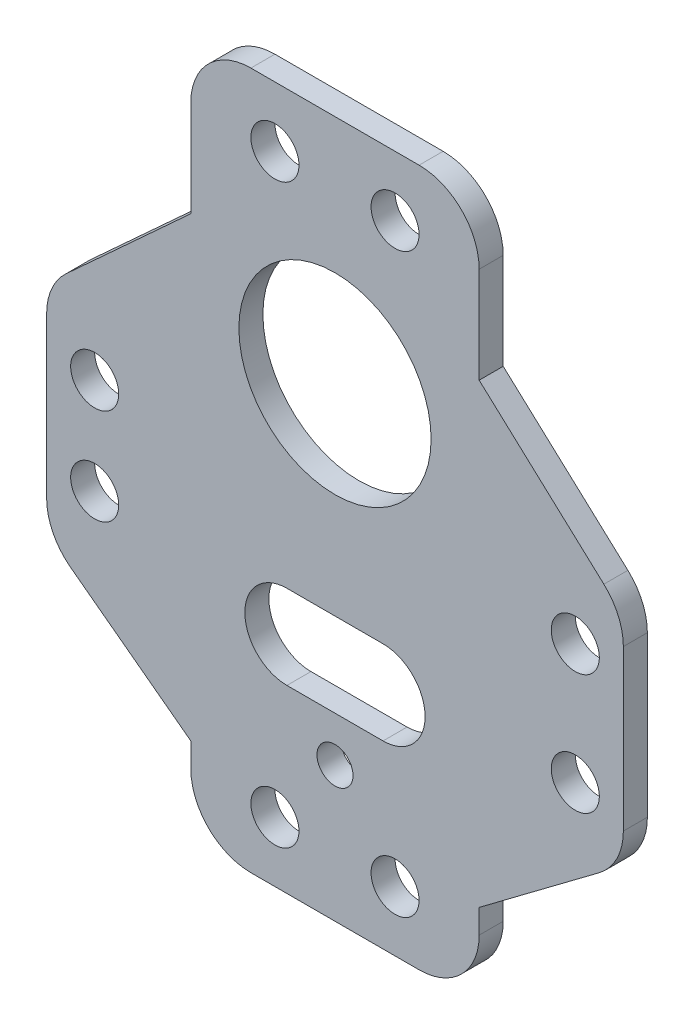
ISO-10303-21;
HEADER;
FILE_DESCRIPTION(('STEP AP214'),'2;1');
FILE_NAME('part.step','',(''),(''),'','','');
FILE_SCHEMA(('AUTOMOTIVE_DESIGN { 1 0 10303 214 1 1 1 1 }'));
ENDSEC;
DATA;
#1=APPLICATION_CONTEXT('core data for automotive mechanical design processes');
#2=APPLICATION_PROTOCOL_DEFINITION('international standard','automotive_design',2000,#1);
#3=PRODUCT_CONTEXT('',#1,'mechanical');
#4=PRODUCT('Part','Part','',(#3));
#5=PRODUCT_RELATED_PRODUCT_CATEGORY('part','',(#4));
#6=PRODUCT_DEFINITION_FORMATION('','',#4);
#7=PRODUCT_DEFINITION_CONTEXT('part definition',#1,'design');
#8=PRODUCT_DEFINITION('design','',#6,#7);
#9=PRODUCT_DEFINITION_SHAPE('','',#8);
#10=(LENGTH_UNIT() NAMED_UNIT(*) SI_UNIT(.MILLI.,.METRE.));
#11=(NAMED_UNIT(*) PLANE_ANGLE_UNIT() SI_UNIT($,.RADIAN.));
#12=(NAMED_UNIT(*) SI_UNIT($,.STERADIAN.) SOLID_ANGLE_UNIT());
#13=UNCERTAINTY_MEASURE_WITH_UNIT(LENGTH_MEASURE(1.E-05),#10,'distance_accuracy_value','');
#14=(GEOMETRIC_REPRESENTATION_CONTEXT(3) GLOBAL_UNCERTAINTY_ASSIGNED_CONTEXT((#13)) GLOBAL_UNIT_ASSIGNED_CONTEXT((#10,
#11,#12)) REPRESENTATION_CONTEXT('',''));
#15=CARTESIAN_POINT('',(0.,0.,0.));
#16=DIRECTION('',(0.,0.,1.));
#17=DIRECTION('',(1.,0.,0.));
#18=AXIS2_PLACEMENT_3D('',#15,#16,#17);
#19=CARTESIAN_POINT('',(0.,0.,2.));
#20=DIRECTION('',(0.,0.,-1.));
#21=DIRECTION('',(-1.,0.,0.));
#22=AXIS2_PLACEMENT_3D('',#19,#20,#21);
#23=PLANE('',#22);
#24=CARTESIAN_POINT('',(28.,-57.,2.));
#25=DIRECTION('',(0.,0.,-1.));
#26=DIRECTION('',(-1.,0.,0.));
#27=AXIS2_PLACEMENT_3D('',#24,#25,#26);
#28=CIRCLE('',#27,2.);
#29=CARTESIAN_POINT('',(26.,-57.,2.));
#30=VERTEX_POINT('',#29);
#31=EDGE_CURVE('E1248',#30,#30,#28,.T.);
#32=ORIENTED_EDGE('',*,*,#31,.T.);
#33=EDGE_LOOP('',(#32));
#34=FACE_BOUND('',#33,.T.);
#35=CARTESIAN_POINT('',(28.,-47.,2.));
#36=DIRECTION('',(0.,0.,-1.));
#37=DIRECTION('',(-1.,0.,0.));
#38=AXIS2_PLACEMENT_3D('',#35,#36,#37);
#39=CIRCLE('',#38,2.);
#40=CARTESIAN_POINT('',(26.,-47.,2.));
#41=VERTEX_POINT('',#40);
#42=EDGE_CURVE('E1241',#41,#41,#39,.T.);
#43=ORIENTED_EDGE('',*,*,#42,.T.);
#44=EDGE_LOOP('',(#43));
#45=FACE_BOUND('',#44,.T.);
#46=CARTESIAN_POINT('',(8.00000000000001,-38.25,2.));
#47=DIRECTION('',(0.,0.,1.));
#48=DIRECTION('',(1.,0.,0.));
#49=AXIS2_PLACEMENT_3D('',#46,#47,#48);
#50=CIRCLE('',#49,8.);
#51=CARTESIAN_POINT('',(16.,-38.25,2.));
#52=VERTEX_POINT('',#51);
#53=EDGE_CURVE('E679',#52,#52,#50,.T.);
#54=ORIENTED_EDGE('',*,*,#53,.F.);
#55=EDGE_LOOP('',(#54));
#56=FACE_BOUND('',#55,.T.);
#57=DIRECTION('',(-0.800000000000001,-0.599999999999999,0.));
#58=VECTOR('',#57,1.);
#59=CARTESIAN_POINT('',(32.,-61.,2.));
#60=LINE('',#59,#58);
#61=CARTESIAN_POINT('',(30.,-62.5,2.));
#62=VERTEX_POINT('',#61);
#63=CARTESIAN_POINT('',(20.,-70.,2.));
#64=VERTEX_POINT('',#63);
#65=EDGE_CURVE('E688',#62,#64,#60,.T.);
#66=ORIENTED_EDGE('',*,*,#65,.F.);
#67=CARTESIAN_POINT('',(27.,-58.5,2.));
#68=DIRECTION('',(0.,0.,-1.));
#69=DIRECTION('',(-1.,0.,0.));
#70=AXIS2_PLACEMENT_3D('',#67,#68,#69);
#71=CIRCLE('',#70,5.);
#72=CARTESIAN_POINT('',(32.,-58.5,2.));
#73=VERTEX_POINT('',#72);
#74=EDGE_CURVE('E792',#62,#73,#71,.F.);
#75=ORIENTED_EDGE('',*,*,#74,.T.);
#76=DIRECTION('',(0.,-1.,0.));
#77=VECTOR('',#76,1.);
#78=CARTESIAN_POINT('',(32.,-43.,2.));
#79=LINE('',#78,#77);
#80=CARTESIAN_POINT('',(32.,-45.1995085817082,2.));
#81=VERTEX_POINT('',#80);
#82=EDGE_CURVE('E685',#81,#73,#79,.T.);
#83=ORIENTED_EDGE('',*,*,#82,.F.);
#84=CARTESIAN_POINT('',(27.,-45.1995085817082,2.));
#85=DIRECTION('',(0.,0.,-1.));
#86=DIRECTION('',(-1.,0.,0.));
#87=AXIS2_PLACEMENT_3D('',#84,#85,#86);
#88=CIRCLE('',#87,5.);
#89=CARTESIAN_POINT('',(30.3786231425867,-41.5137378807045,2.));
#90=VERTEX_POINT('',#89);
#91=EDGE_CURVE('E790',#81,#90,#88,.F.);
#92=ORIENTED_EDGE('',*,*,#91,.T.);
#93=DIRECTION('',(-0.737154140200742,0.675724628517346,0.));
#94=VECTOR('',#93,1.);
#95=CARTESIAN_POINT('',(32.,-43.,2.));
#96=LINE('',#95,#94);
#97=CARTESIAN_POINT('',(20.,-32.,2.));
#98=VERTEX_POINT('',#97);
#99=EDGE_CURVE('E713',#90,#98,#96,.T.);
#100=ORIENTED_EDGE('',*,*,#99,.T.);
#101=DIRECTION('',(0.,1.,0.));
#102=VECTOR('',#101,1.);
#103=CARTESIAN_POINT('',(20.,-32.,2.));
#104=LINE('',#103,#102);
#105=CARTESIAN_POINT('',(20.,-24.,2.));
#106=VERTEX_POINT('',#105);
#107=EDGE_CURVE('E710',#98,#106,#104,.T.);
#108=ORIENTED_EDGE('',*,*,#107,.T.);
#109=CARTESIAN_POINT('',(15.,-24.,2.));
#110=DIRECTION('',(0.,0.,-1.));
#111=DIRECTION('',(-1.,0.,0.));
#112=AXIS2_PLACEMENT_3D('',#109,#110,#111);
#113=CIRCLE('',#112,5.);
#114=CARTESIAN_POINT('',(15.,-19.,2.));
#115=VERTEX_POINT('',#114);
#116=EDGE_CURVE('E782',#106,#115,#113,.F.);
#117=ORIENTED_EDGE('',*,*,#116,.T.);
#118=DIRECTION('',(-1.,0.,0.));
#119=VECTOR('',#118,1.);
#120=CARTESIAN_POINT('',(20.,-19.,2.));
#121=LINE('',#120,#119);
#122=CARTESIAN_POINT('',(0.999999999999997,-19.,2.));
#123=VERTEX_POINT('',#122);
#124=EDGE_CURVE('E707',#115,#123,#121,.T.);
#125=ORIENTED_EDGE('',*,*,#124,.T.);
#126=CARTESIAN_POINT('',(0.999999999999999,-24.,2.));
#127=DIRECTION('',(0.,0.,-1.));
#128=DIRECTION('',(-1.,0.,0.));
#129=AXIS2_PLACEMENT_3D('',#126,#127,#128);
#130=CIRCLE('',#129,5.);
#131=CARTESIAN_POINT('',(-4.,-24.,2.));
#132=VERTEX_POINT('',#131);
#133=EDGE_CURVE('E784',#123,#132,#130,.F.);
#134=ORIENTED_EDGE('',*,*,#133,.T.);
#135=DIRECTION('',(0.,1.,0.));
#136=VECTOR('',#135,1.);
#137=CARTESIAN_POINT('',(-4.00000000000001,-32.,2.));
#138=LINE('',#137,#136);
#139=CARTESIAN_POINT('',(-4.00000000000001,-32.,2.));
#140=VERTEX_POINT('',#139);
#141=EDGE_CURVE('E704',#140,#132,#138,.T.);
#142=ORIENTED_EDGE('',*,*,#141,.F.);
#143=DIRECTION('',(0.737154140200741,0.675724628517347,0.));
#144=VECTOR('',#143,1.);
#145=CARTESIAN_POINT('',(-16.,-43.,2.));
#146=LINE('',#145,#144);
#147=CARTESIAN_POINT('',(-14.3786231425867,-41.5137378807045,2.));
#148=VERTEX_POINT('',#147);
#149=EDGE_CURVE('E702',#148,#140,#146,.T.);
#150=ORIENTED_EDGE('',*,*,#149,.F.);
#151=CARTESIAN_POINT('',(-11.,-45.1995085817082,2.));
#152=DIRECTION('',(0.,0.,-1.));
#153=DIRECTION('',(-1.,0.,0.));
#154=AXIS2_PLACEMENT_3D('',#151,#152,#153);
#155=CIRCLE('',#154,5.);
#156=CARTESIAN_POINT('',(-16.,-45.1995085817082,2.));
#157=VERTEX_POINT('',#156);
#158=EDGE_CURVE('E786',#148,#157,#155,.F.);
#159=ORIENTED_EDGE('',*,*,#158,.T.);
#160=DIRECTION('',(0.,-1.,0.));
#161=VECTOR('',#160,1.);
#162=CARTESIAN_POINT('',(-16.,-43.,2.));
#163=LINE('',#162,#161);
#164=CARTESIAN_POINT('',(-16.,-58.5,2.));
#165=VERTEX_POINT('',#164);
#166=EDGE_CURVE('E699',#157,#165,#163,.T.);
#167=ORIENTED_EDGE('',*,*,#166,.T.);
#168=CARTESIAN_POINT('',(-11.,-58.5,2.));
#169=DIRECTION('',(0.,0.,-1.));
#170=DIRECTION('',(-1.,0.,0.));
#171=AXIS2_PLACEMENT_3D('',#168,#169,#170);
#172=CIRCLE('',#171,5.);
#173=CARTESIAN_POINT('',(-14.,-62.5,2.));
#174=VERTEX_POINT('',#173);
#175=EDGE_CURVE('E788',#165,#174,#172,.F.);
#176=ORIENTED_EDGE('',*,*,#175,.T.);
#177=DIRECTION('',(0.8,-0.6,0.));
#178=VECTOR('',#177,1.);
#179=CARTESIAN_POINT('',(-16.,-61.,2.));
#180=LINE('',#179,#178);
#181=CARTESIAN_POINT('',(-4.,-70.,2.));
#182=VERTEX_POINT('',#181);
#183=EDGE_CURVE('E697',#174,#182,#180,.T.);
#184=ORIENTED_EDGE('',*,*,#183,.T.);
#185=DIRECTION('',(0.,-1.,0.));
#186=VECTOR('',#185,1.);
#187=CARTESIAN_POINT('',(-4.,-70.,2.));
#188=LINE('',#187,#186);
#189=CARTESIAN_POINT('',(-4.,-72.,2.));
#190=VERTEX_POINT('',#189);
#191=EDGE_CURVE('E695',#182,#190,#188,.T.);
#192=ORIENTED_EDGE('',*,*,#191,.T.);
#193=CARTESIAN_POINT('',(1.,-72.,2.));
#194=DIRECTION('',(0.,0.,-1.));
#195=DIRECTION('',(-1.,0.,0.));
#196=AXIS2_PLACEMENT_3D('',#193,#194,#195);
#197=CIRCLE('',#196,5.);
#198=CARTESIAN_POINT('',(1.,-77.,2.));
#199=VERTEX_POINT('',#198);
#200=EDGE_CURVE('E494',#190,#199,#197,.F.);
#201=ORIENTED_EDGE('',*,*,#200,.T.);
#202=DIRECTION('',(-1.,0.,0.));
#203=VECTOR('',#202,1.);
#204=CARTESIAN_POINT('',(20.,-77.,2.));
#205=LINE('',#204,#203);
#206=CARTESIAN_POINT('',(15.,-77.,2.));
#207=VERTEX_POINT('',#206);
#208=EDGE_CURVE('E693',#207,#199,#205,.T.);
#209=ORIENTED_EDGE('',*,*,#208,.F.);
#210=CARTESIAN_POINT('',(15.,-72.,2.));
#211=DIRECTION('',(0.,0.,-1.));
#212=DIRECTION('',(-1.,0.,0.));
#213=AXIS2_PLACEMENT_3D('',#210,#211,#212);
#214=CIRCLE('',#213,5.);
#215=CARTESIAN_POINT('',(20.,-72.,2.));
#216=VERTEX_POINT('',#215);
#217=EDGE_CURVE('E488',#207,#216,#214,.F.);
#218=ORIENTED_EDGE('',*,*,#217,.T.);
#219=DIRECTION('',(0.,-1.,0.));
#220=VECTOR('',#219,1.);
#221=CARTESIAN_POINT('',(20.,-70.,2.));
#222=LINE('',#221,#220);
#223=EDGE_CURVE('E691',#64,#216,#222,.T.);
#224=ORIENTED_EDGE('',*,*,#223,.F.);
#225=EDGE_LOOP('',(#66,#75,#83,#92,#100,#108,#117,#125,#134,#142,#150,#159,#167,#176,#184,#192,
#201,#209,#218,#224));
#226=FACE_BOUND('',#225,.T.);
#227=DIRECTION('',(1.,0.,0.));
#228=VECTOR('',#227,1.);
#229=CARTESIAN_POINT('',(4.,-62.,2.));
#230=LINE('',#229,#228);
#231=CARTESIAN_POINT('',(4.,-62.,2.));
#232=VERTEX_POINT('',#231);
#233=CARTESIAN_POINT('',(12.,-62.,2.));
#234=VERTEX_POINT('',#233);
#235=EDGE_CURVE('E636',#232,#234,#230,.T.);
#236=ORIENTED_EDGE('',*,*,#235,.F.);
#237=CARTESIAN_POINT('',(4.,-58.5,2.));
#238=DIRECTION('',(0.,0.,1.));
#239=DIRECTION('',(1.,0.,0.));
#240=AXIS2_PLACEMENT_3D('',#237,#238,#239);
#241=CIRCLE('',#240,3.5);
#242=CARTESIAN_POINT('',(4.,-55.,2.));
#243=VERTEX_POINT('',#242);
#244=EDGE_CURVE('E661',#243,#232,#241,.T.);
#245=ORIENTED_EDGE('',*,*,#244,.F.);
#246=DIRECTION('',(1.,0.,0.));
#247=VECTOR('',#246,1.);
#248=CARTESIAN_POINT('',(4.,-55.,2.));
#249=LINE('',#248,#247);
#250=CARTESIAN_POINT('',(12.,-55.,2.));
#251=VERTEX_POINT('',#250);
#252=EDGE_CURVE('E659',#243,#251,#249,.T.);
#253=ORIENTED_EDGE('',*,*,#252,.T.);
#254=CARTESIAN_POINT('',(12.,-58.5,2.));
#255=DIRECTION('',(0.,0.,1.));
#256=DIRECTION('',(1.,0.,0.));
#257=AXIS2_PLACEMENT_3D('',#254,#255,#256);
#258=CIRCLE('',#257,3.5);
#259=EDGE_CURVE('E646',#234,#251,#258,.T.);
#260=ORIENTED_EDGE('',*,*,#259,.F.);
#261=EDGE_LOOP('',(#236,#245,#253,#260));
#262=FACE_BOUND('',#261,.T.);
#263=CARTESIAN_POINT('',(13.,-72.,2.));
#264=DIRECTION('',(0.,0.,1.));
#265=DIRECTION('',(1.,0.,0.));
#266=AXIS2_PLACEMENT_3D('',#263,#264,#265);
#267=CIRCLE('',#266,2.);
#268=CARTESIAN_POINT('',(15.,-72.,2.));
#269=VERTEX_POINT('',#268);
#270=EDGE_CURVE('E668',#269,#269,#267,.T.);
#271=ORIENTED_EDGE('',*,*,#270,.F.);
#272=EDGE_LOOP('',(#271));
#273=FACE_BOUND('',#272,.T.);
#274=CARTESIAN_POINT('',(3.,-72.,2.));
#275=DIRECTION('',(0.,0.,1.));
#276=DIRECTION('',(1.,0.,0.));
#277=AXIS2_PLACEMENT_3D('',#274,#275,#276);
#278=CIRCLE('',#277,2.);
#279=CARTESIAN_POINT('',(5.,-72.,2.));
#280=VERTEX_POINT('',#279);
#281=EDGE_CURVE('E1253',#280,#280,#278,.T.);
#282=ORIENTED_EDGE('',*,*,#281,.F.);
#283=EDGE_LOOP('',(#282));
#284=FACE_BOUND('',#283,.T.);
#285=CARTESIAN_POINT('',(-12.,-56.,2.));
#286=DIRECTION('',(0.,0.,1.));
#287=DIRECTION('',(1.,0.,0.));
#288=AXIS2_PLACEMENT_3D('',#285,#286,#287);
#289=CIRCLE('',#288,2.);
#290=CARTESIAN_POINT('',(-9.99999999999999,-56.,2.));
#291=VERTEX_POINT('',#290);
#292=EDGE_CURVE('E1258',#291,#291,#289,.T.);
#293=ORIENTED_EDGE('',*,*,#292,.F.);
#294=EDGE_LOOP('',(#293));
#295=FACE_BOUND('',#294,.T.);
#296=CARTESIAN_POINT('',(-12.,-48.,2.));
#297=DIRECTION('',(0.,0.,1.));
#298=DIRECTION('',(1.,0.,0.));
#299=AXIS2_PLACEMENT_3D('',#296,#297,#298);
#300=CIRCLE('',#299,2.);
#301=CARTESIAN_POINT('',(-9.99999999999999,-48.,2.));
#302=VERTEX_POINT('',#301);
#303=EDGE_CURVE('E1264',#302,#302,#300,.T.);
#304=ORIENTED_EDGE('',*,*,#303,.F.);
#305=EDGE_LOOP('',(#304));
#306=FACE_BOUND('',#305,.T.);
#307=CARTESIAN_POINT('',(13.,-24.,2.));
#308=DIRECTION('',(0.,0.,1.));
#309=DIRECTION('',(1.,0.,0.));
#310=AXIS2_PLACEMENT_3D('',#307,#308,#309);
#311=CIRCLE('',#310,2.);
#312=CARTESIAN_POINT('',(15.,-24.,2.));
#313=VERTEX_POINT('',#312);
#314=EDGE_CURVE('E1270',#313,#313,#311,.T.);
#315=ORIENTED_EDGE('',*,*,#314,.F.);
#316=EDGE_LOOP('',(#315));
#317=FACE_BOUND('',#316,.T.);
#318=CARTESIAN_POINT('',(3.,-24.,2.));
#319=DIRECTION('',(0.,0.,1.));
#320=DIRECTION('',(1.,0.,0.));
#321=AXIS2_PLACEMENT_3D('',#318,#319,#320);
#322=CIRCLE('',#321,2.);
#323=CARTESIAN_POINT('',(5.,-24.,2.));
#324=VERTEX_POINT('',#323);
#325=EDGE_CURVE('E1276',#324,#324,#322,.T.);
#326=ORIENTED_EDGE('',*,*,#325,.F.);
#327=EDGE_LOOP('',(#326));
#328=FACE_BOUND('',#327,.T.);
#329=CARTESIAN_POINT('',(8.00000000000001,-65.75,2.));
#330=DIRECTION('',(0.,0.,1.));
#331=DIRECTION('',(1.,0.,0.));
#332=AXIS2_PLACEMENT_3D('',#329,#330,#331);
#333=CIRCLE('',#332,1.5);
#334=CARTESIAN_POINT('',(9.50000000000002,-65.75,2.));
#335=VERTEX_POINT('',#334);
#336=EDGE_CURVE('E1282',#335,#335,#333,.T.);
#337=ORIENTED_EDGE('',*,*,#336,.F.);
#338=EDGE_LOOP('',(#337));
#339=FACE_BOUND('',#338,.T.);
#340=ADVANCED_FACE('F473',(#34,#45,#56,#226,#262,#273,#284,#295,#306,#317,#328,#339),#23,.F.);
#341=CARTESIAN_POINT('',(0.,0.,0.));
#342=DIRECTION('',(0.,0.,-1.));
#343=DIRECTION('',(-1.,0.,0.));
#344=AXIS2_PLACEMENT_3D('',#341,#342,#343);
#345=PLANE('',#344);
#346=CARTESIAN_POINT('',(3.,-24.,0.));
#347=DIRECTION('',(0.,0.,1.));
#348=DIRECTION('',(1.,0.,0.));
#349=AXIS2_PLACEMENT_3D('',#346,#347,#348);
#350=CIRCLE('',#349,2.);
#351=CARTESIAN_POINT('',(5.,-24.,0.));
#352=VERTEX_POINT('',#351);
#353=EDGE_CURVE('E1279',#352,#352,#350,.T.);
#354=ORIENTED_EDGE('',*,*,#353,.T.);
#355=EDGE_LOOP('',(#354));
#356=FACE_BOUND('',#355,.T.);
#357=CARTESIAN_POINT('',(-12.,-48.,0.));
#358=DIRECTION('',(0.,0.,1.));
#359=DIRECTION('',(1.,0.,0.));
#360=AXIS2_PLACEMENT_3D('',#357,#358,#359);
#361=CIRCLE('',#360,2.);
#362=CARTESIAN_POINT('',(-9.99999999999999,-48.,0.));
#363=VERTEX_POINT('',#362);
#364=EDGE_CURVE('E1267',#363,#363,#361,.T.);
#365=ORIENTED_EDGE('',*,*,#364,.T.);
#366=EDGE_LOOP('',(#365));
#367=FACE_BOUND('',#366,.T.);
#368=CARTESIAN_POINT('',(3.,-72.,0.));
#369=DIRECTION('',(0.,0.,1.));
#370=DIRECTION('',(1.,0.,0.));
#371=AXIS2_PLACEMENT_3D('',#368,#369,#370);
#372=CIRCLE('',#371,2.);
#373=CARTESIAN_POINT('',(5.,-72.,0.));
#374=VERTEX_POINT('',#373);
#375=EDGE_CURVE('E1255',#374,#374,#372,.T.);
#376=ORIENTED_EDGE('',*,*,#375,.T.);
#377=EDGE_LOOP('',(#376));
#378=FACE_BOUND('',#377,.T.);
#379=CARTESIAN_POINT('',(28.,-57.,0.));
#380=DIRECTION('',(0.,0.,-1.));
#381=DIRECTION('',(-1.,0.,0.));
#382=AXIS2_PLACEMENT_3D('',#379,#380,#381);
#383=CIRCLE('',#382,2.);
#384=CARTESIAN_POINT('',(26.,-57.,0.));
#385=VERTEX_POINT('',#384);
#386=EDGE_CURVE('E1250',#385,#385,#383,.T.);
#387=ORIENTED_EDGE('',*,*,#386,.F.);
#388=EDGE_LOOP('',(#387));
#389=FACE_BOUND('',#388,.T.);
#390=CARTESIAN_POINT('',(28.,-47.,0.));
#391=DIRECTION('',(0.,0.,-1.));
#392=DIRECTION('',(-1.,0.,0.));
#393=AXIS2_PLACEMENT_3D('',#390,#391,#392);
#394=CIRCLE('',#393,2.);
#395=CARTESIAN_POINT('',(26.,-47.,0.));
#396=VERTEX_POINT('',#395);
#397=EDGE_CURVE('E1244',#396,#396,#394,.T.);
#398=ORIENTED_EDGE('',*,*,#397,.F.);
#399=EDGE_LOOP('',(#398));
#400=FACE_BOUND('',#399,.T.);
#401=CARTESIAN_POINT('',(4.,-58.5,0.));
#402=DIRECTION('',(0.,0.,1.));
#403=DIRECTION('',(1.,0.,0.));
#404=AXIS2_PLACEMENT_3D('',#401,#402,#403);
#405=CIRCLE('',#404,3.5);
#406=CARTESIAN_POINT('',(4.,-55.,0.));
#407=VERTEX_POINT('',#406);
#408=CARTESIAN_POINT('',(4.,-62.,0.));
#409=VERTEX_POINT('',#408);
#410=EDGE_CURVE('E647',#407,#409,#405,.T.);
#411=ORIENTED_EDGE('',*,*,#410,.T.);
#412=DIRECTION('',(1.,0.,0.));
#413=VECTOR('',#412,1.);
#414=CARTESIAN_POINT('',(4.,-62.,0.));
#415=LINE('',#414,#413);
#416=CARTESIAN_POINT('',(12.,-62.,0.));
#417=VERTEX_POINT('',#416);
#418=EDGE_CURVE('E666',#409,#417,#415,.T.);
#419=ORIENTED_EDGE('',*,*,#418,.T.);
#420=CARTESIAN_POINT('',(12.,-58.5,0.));
#421=DIRECTION('',(0.,0.,1.));
#422=DIRECTION('',(1.,0.,0.));
#423=AXIS2_PLACEMENT_3D('',#420,#421,#422);
#424=CIRCLE('',#423,3.5);
#425=CARTESIAN_POINT('',(12.,-55.,0.));
#426=VERTEX_POINT('',#425);
#427=EDGE_CURVE('E653',#417,#426,#424,.T.);
#428=ORIENTED_EDGE('',*,*,#427,.T.);
#429=DIRECTION('',(1.,0.,0.));
#430=VECTOR('',#429,1.);
#431=CARTESIAN_POINT('',(4.,-55.,0.));
#432=LINE('',#431,#430);
#433=EDGE_CURVE('E670',#407,#426,#432,.T.);
#434=ORIENTED_EDGE('',*,*,#433,.F.);
#435=EDGE_LOOP('',(#411,#419,#428,#434));
#436=FACE_BOUND('',#435,.T.);
#437=CARTESIAN_POINT('',(8.00000000000001,-38.25,0.));
#438=DIRECTION('',(0.,0.,1.));
#439=DIRECTION('',(1.,0.,0.));
#440=AXIS2_PLACEMENT_3D('',#437,#438,#439);
#441=CIRCLE('',#440,8.);
#442=CARTESIAN_POINT('',(16.,-38.25,0.));
#443=VERTEX_POINT('',#442);
#444=EDGE_CURVE('E654',#443,#443,#441,.T.);
#445=ORIENTED_EDGE('',*,*,#444,.T.);
#446=EDGE_LOOP('',(#445));
#447=FACE_BOUND('',#446,.T.);
#448=DIRECTION('',(0.,-1.,0.));
#449=VECTOR('',#448,1.);
#450=CARTESIAN_POINT('',(32.,-43.,0.));
#451=LINE('',#450,#449);
#452=CARTESIAN_POINT('',(32.,-45.1995085817082,0.));
#453=VERTEX_POINT('',#452);
#454=CARTESIAN_POINT('',(32.,-58.5,0.));
#455=VERTEX_POINT('',#454);
#456=EDGE_CURVE('E682',#453,#455,#451,.T.);
#457=ORIENTED_EDGE('',*,*,#456,.T.);
#458=CARTESIAN_POINT('',(27.,-58.5,0.));
#459=DIRECTION('',(0.,0.,-1.));
#460=DIRECTION('',(-1.,0.,0.));
#461=AXIS2_PLACEMENT_3D('',#458,#459,#460);
#462=CIRCLE('',#461,5.);
#463=CARTESIAN_POINT('',(30.,-62.5,0.));
#464=VERTEX_POINT('',#463);
#465=EDGE_CURVE('E776',#455,#464,#462,.T.);
#466=ORIENTED_EDGE('',*,*,#465,.T.);
#467=DIRECTION('',(-0.800000000000001,-0.599999999999999,0.));
#468=VECTOR('',#467,1.);
#469=CARTESIAN_POINT('',(32.,-61.,0.));
#470=LINE('',#469,#468);
#471=CARTESIAN_POINT('',(20.,-70.,0.));
#472=VERTEX_POINT('',#471);
#473=EDGE_CURVE('E718',#464,#472,#470,.T.);
#474=ORIENTED_EDGE('',*,*,#473,.T.);
#475=DIRECTION('',(0.,-1.,0.));
#476=VECTOR('',#475,1.);
#477=CARTESIAN_POINT('',(20.,-70.,0.));
#478=LINE('',#477,#476);
#479=CARTESIAN_POINT('',(20.,-72.,0.));
#480=VERTEX_POINT('',#479);
#481=EDGE_CURVE('E720',#472,#480,#478,.T.);
#482=ORIENTED_EDGE('',*,*,#481,.T.);
#483=CARTESIAN_POINT('',(15.,-72.,0.));
#484=DIRECTION('',(0.,0.,-1.));
#485=DIRECTION('',(-1.,0.,0.));
#486=AXIS2_PLACEMENT_3D('',#483,#484,#485);
#487=CIRCLE('',#486,5.);
#488=CARTESIAN_POINT('',(15.,-77.,0.));
#489=VERTEX_POINT('',#488);
#490=EDGE_CURVE('E764',#480,#489,#487,.T.);
#491=ORIENTED_EDGE('',*,*,#490,.T.);
#492=DIRECTION('',(-1.,0.,0.));
#493=VECTOR('',#492,1.);
#494=CARTESIAN_POINT('',(20.,-77.,0.));
#495=LINE('',#494,#493);
#496=CARTESIAN_POINT('',(1.,-77.,0.));
#497=VERTEX_POINT('',#496);
#498=EDGE_CURVE('E723',#489,#497,#495,.T.);
#499=ORIENTED_EDGE('',*,*,#498,.T.);
#500=CARTESIAN_POINT('',(1.,-72.,0.));
#501=DIRECTION('',(0.,0.,-1.));
#502=DIRECTION('',(-1.,0.,0.));
#503=AXIS2_PLACEMENT_3D('',#500,#501,#502);
#504=CIRCLE('',#503,5.);
#505=CARTESIAN_POINT('',(-4.,-72.,0.));
#506=VERTEX_POINT('',#505);
#507=EDGE_CURVE('E762',#497,#506,#504,.T.);
#508=ORIENTED_EDGE('',*,*,#507,.T.);
#509=DIRECTION('',(0.,-1.,0.));
#510=VECTOR('',#509,1.);
#511=CARTESIAN_POINT('',(-4.,-70.,0.));
#512=LINE('',#511,#510);
#513=CARTESIAN_POINT('',(-4.,-70.,0.));
#514=VERTEX_POINT('',#513);
#515=EDGE_CURVE('E726',#514,#506,#512,.T.);
#516=ORIENTED_EDGE('',*,*,#515,.F.);
#517=DIRECTION('',(0.8,-0.6,0.));
#518=VECTOR('',#517,1.);
#519=CARTESIAN_POINT('',(-16.,-61.,0.));
#520=LINE('',#519,#518);
#521=CARTESIAN_POINT('',(-14.,-62.5,0.));
#522=VERTEX_POINT('',#521);
#523=EDGE_CURVE('E729',#522,#514,#520,.T.);
#524=ORIENTED_EDGE('',*,*,#523,.F.);
#525=CARTESIAN_POINT('',(-11.,-58.5,0.));
#526=DIRECTION('',(0.,0.,-1.));
#527=DIRECTION('',(-1.,0.,0.));
#528=AXIS2_PLACEMENT_3D('',#525,#526,#527);
#529=CIRCLE('',#528,5.);
#530=CARTESIAN_POINT('',(-16.,-58.5,0.));
#531=VERTEX_POINT('',#530);
#532=EDGE_CURVE('E772',#522,#531,#529,.T.);
#533=ORIENTED_EDGE('',*,*,#532,.T.);
#534=DIRECTION('',(0.,-1.,0.));
#535=VECTOR('',#534,1.);
#536=CARTESIAN_POINT('',(-16.,-43.,0.));
#537=LINE('',#536,#535);
#538=CARTESIAN_POINT('',(-16.,-45.1995085817082,0.));
#539=VERTEX_POINT('',#538);
#540=EDGE_CURVE('E731',#539,#531,#537,.T.);
#541=ORIENTED_EDGE('',*,*,#540,.F.);
#542=CARTESIAN_POINT('',(-11.,-45.1995085817082,0.));
#543=DIRECTION('',(0.,0.,-1.));
#544=DIRECTION('',(-1.,0.,0.));
#545=AXIS2_PLACEMENT_3D('',#542,#543,#544);
#546=CIRCLE('',#545,5.);
#547=CARTESIAN_POINT('',(-14.3786231425867,-41.5137378807045,0.));
#548=VERTEX_POINT('',#547);
#549=EDGE_CURVE('E770',#539,#548,#546,.T.);
#550=ORIENTED_EDGE('',*,*,#549,.T.);
#551=DIRECTION('',(0.737154140200741,0.675724628517347,0.));
#552=VECTOR('',#551,1.);
#553=CARTESIAN_POINT('',(-16.,-43.,0.));
#554=LINE('',#553,#552);
#555=CARTESIAN_POINT('',(-4.00000000000001,-32.,0.));
#556=VERTEX_POINT('',#555);
#557=EDGE_CURVE('E734',#548,#556,#554,.T.);
#558=ORIENTED_EDGE('',*,*,#557,.T.);
#559=DIRECTION('',(0.,1.,0.));
#560=VECTOR('',#559,1.);
#561=CARTESIAN_POINT('',(-4.00000000000001,-32.,0.));
#562=LINE('',#561,#560);
#563=CARTESIAN_POINT('',(-4.,-24.,0.));
#564=VERTEX_POINT('',#563);
#565=EDGE_CURVE('E736',#556,#564,#562,.T.);
#566=ORIENTED_EDGE('',*,*,#565,.T.);
#567=CARTESIAN_POINT('',(0.999999999999999,-24.,0.));
#568=DIRECTION('',(0.,0.,-1.));
#569=DIRECTION('',(-1.,0.,0.));
#570=AXIS2_PLACEMENT_3D('',#567,#568,#569);
#571=CIRCLE('',#570,5.);
#572=CARTESIAN_POINT('',(0.999999999999997,-19.,0.));
#573=VERTEX_POINT('',#572);
#574=EDGE_CURVE('E768',#564,#573,#571,.T.);
#575=ORIENTED_EDGE('',*,*,#574,.T.);
#576=DIRECTION('',(-1.,0.,0.));
#577=VECTOR('',#576,1.);
#578=CARTESIAN_POINT('',(20.,-19.,0.));
#579=LINE('',#578,#577);
#580=CARTESIAN_POINT('',(15.,-19.,0.));
#581=VERTEX_POINT('',#580);
#582=EDGE_CURVE('E739',#581,#573,#579,.T.);
#583=ORIENTED_EDGE('',*,*,#582,.F.);
#584=CARTESIAN_POINT('',(15.,-24.,0.));
#585=DIRECTION('',(0.,0.,-1.));
#586=DIRECTION('',(-1.,0.,0.));
#587=AXIS2_PLACEMENT_3D('',#584,#585,#586);
#588=CIRCLE('',#587,5.);
#589=CARTESIAN_POINT('',(20.,-24.,0.));
#590=VERTEX_POINT('',#589);
#591=EDGE_CURVE('E766',#581,#590,#588,.T.);
#592=ORIENTED_EDGE('',*,*,#591,.T.);
#593=DIRECTION('',(0.,1.,0.));
#594=VECTOR('',#593,1.);
#595=CARTESIAN_POINT('',(20.,-32.,0.));
#596=LINE('',#595,#594);
#597=CARTESIAN_POINT('',(20.,-32.,0.));
#598=VERTEX_POINT('',#597);
#599=EDGE_CURVE('E742',#598,#590,#596,.T.);
#600=ORIENTED_EDGE('',*,*,#599,.F.);
#601=DIRECTION('',(-0.737154140200742,0.675724628517346,0.));
#602=VECTOR('',#601,1.);
#603=CARTESIAN_POINT('',(32.,-43.,0.));
#604=LINE('',#603,#602);
#605=CARTESIAN_POINT('',(30.3786231425867,-41.5137378807045,0.));
#606=VERTEX_POINT('',#605);
#607=EDGE_CURVE('E689',#606,#598,#604,.T.);
#608=ORIENTED_EDGE('',*,*,#607,.F.);
#609=CARTESIAN_POINT('',(27.,-45.1995085817082,0.));
#610=DIRECTION('',(0.,0.,-1.));
#611=DIRECTION('',(-1.,0.,0.));
#612=AXIS2_PLACEMENT_3D('',#609,#610,#611);
#613=CIRCLE('',#612,5.);
#614=EDGE_CURVE('E774',#606,#453,#613,.T.);
#615=ORIENTED_EDGE('',*,*,#614,.T.);
#616=EDGE_LOOP('',(#457,#466,#474,#482,#491,#499,#508,#516,#524,#533,#541,#550,#558,#566,#575,
#583,#592,#600,#608,#615));
#617=FACE_BOUND('',#616,.T.);
#618=CARTESIAN_POINT('',(13.,-72.,0.));
#619=DIRECTION('',(0.,0.,1.));
#620=DIRECTION('',(1.,0.,0.));
#621=AXIS2_PLACEMENT_3D('',#618,#619,#620);
#622=CIRCLE('',#621,2.);
#623=CARTESIAN_POINT('',(15.,-72.,0.));
#624=VERTEX_POINT('',#623);
#625=EDGE_CURVE('E1240',#624,#624,#622,.T.);
#626=ORIENTED_EDGE('',*,*,#625,.T.);
#627=EDGE_LOOP('',(#626));
#628=FACE_BOUND('',#627,.T.);
#629=CARTESIAN_POINT('',(-12.,-56.,0.));
#630=DIRECTION('',(0.,0.,1.));
#631=DIRECTION('',(1.,0.,0.));
#632=AXIS2_PLACEMENT_3D('',#629,#630,#631);
#633=CIRCLE('',#632,2.);
#634=CARTESIAN_POINT('',(-9.99999999999999,-56.,0.));
#635=VERTEX_POINT('',#634);
#636=EDGE_CURVE('E1261',#635,#635,#633,.T.);
#637=ORIENTED_EDGE('',*,*,#636,.T.);
#638=EDGE_LOOP('',(#637));
#639=FACE_BOUND('',#638,.T.);
#640=CARTESIAN_POINT('',(13.,-24.,0.));
#641=DIRECTION('',(0.,0.,1.));
#642=DIRECTION('',(1.,0.,0.));
#643=AXIS2_PLACEMENT_3D('',#640,#641,#642);
#644=CIRCLE('',#643,2.);
#645=CARTESIAN_POINT('',(15.,-24.,0.));
#646=VERTEX_POINT('',#645);
#647=EDGE_CURVE('E1273',#646,#646,#644,.T.);
#648=ORIENTED_EDGE('',*,*,#647,.T.);
#649=EDGE_LOOP('',(#648));
#650=FACE_BOUND('',#649,.T.);
#651=CARTESIAN_POINT('',(8.00000000000001,-65.75,0.));
#652=DIRECTION('',(0.,0.,1.));
#653=DIRECTION('',(1.,0.,0.));
#654=AXIS2_PLACEMENT_3D('',#651,#652,#653);
#655=CIRCLE('',#654,1.5);
#656=CARTESIAN_POINT('',(9.50000000000002,-65.75,0.));
#657=VERTEX_POINT('',#656);
#658=EDGE_CURVE('E1285',#657,#657,#655,.T.);
#659=ORIENTED_EDGE('',*,*,#658,.T.);
#660=EDGE_LOOP('',(#659));
#661=FACE_BOUND('',#660,.T.);
#662=ADVANCED_FACE('F836',(#356,#367,#378,#389,#400,#436,#447,#617,#628,#639,#650,#661),#345,.T.);
#663=CARTESIAN_POINT('',(32.,-43.,2.));
#664=DIRECTION('',(1.,0.,0.));
#665=DIRECTION('',(0.,0.,-1.));
#666=AXIS2_PLACEMENT_3D('',#663,#664,#665);
#667=PLANE('',#666);
#668=ORIENTED_EDGE('',*,*,#82,.T.);
#669=DIRECTION('',(0.,0.,-1.));
#670=VECTOR('',#669,1.);
#671=CARTESIAN_POINT('',(32.,-58.5,2.));
#672=LINE('',#671,#670);
#673=EDGE_CURVE('E759',#73,#455,#672,.T.);
#674=ORIENTED_EDGE('',*,*,#673,.T.);
#675=ORIENTED_EDGE('',*,*,#456,.F.);
#676=DIRECTION('',(0.,0.,-1.));
#677=VECTOR('',#676,1.);
#678=CARTESIAN_POINT('',(32.,-45.1995085817082,2.));
#679=LINE('',#678,#677);
#680=EDGE_CURVE('E749',#453,#81,#679,.F.);
#681=ORIENTED_EDGE('',*,*,#680,.T.);
#682=EDGE_LOOP('',(#668,#674,#675,#681));
#683=FACE_BOUND('',#682,.T.);
#684=ADVANCED_FACE('F849',(#683),#667,.T.);
#685=CARTESIAN_POINT('',(32.,-43.,2.));
#686=DIRECTION('',(-0.675724628517346,-0.737154140200742,0.));
#687=DIRECTION('',(0.737154140200742,-0.675724628517346,0.));
#688=AXIS2_PLACEMENT_3D('',#685,#686,#687);
#689=PLANE('',#688);
#690=ORIENTED_EDGE('',*,*,#99,.F.);
#691=DIRECTION('',(0.,0.,-1.));
#692=VECTOR('',#691,1.);
#693=CARTESIAN_POINT('',(30.3786231425867,-41.5137378807045,0.));
#694=LINE('',#693,#692);
#695=EDGE_CURVE('E794',#90,#606,#694,.T.);
#696=ORIENTED_EDGE('',*,*,#695,.T.);
#697=ORIENTED_EDGE('',*,*,#607,.T.);
#698=DIRECTION('',(0.,0.,-1.));
#699=VECTOR('',#698,1.);
#700=CARTESIAN_POINT('',(20.,-32.,2.));
#701=LINE('',#700,#699);
#702=EDGE_CURVE('E746',#98,#598,#701,.T.);
#703=ORIENTED_EDGE('',*,*,#702,.F.);
#704=EDGE_LOOP('',(#690,#696,#697,#703));
#705=FACE_BOUND('',#704,.T.);
#706=ADVANCED_FACE('F859',(#705),#689,.F.);
#707=CARTESIAN_POINT('',(20.,-32.,2.));
#708=DIRECTION('',(-1.,0.,0.));
#709=DIRECTION('',(0.,-1.,0.));
#710=AXIS2_PLACEMENT_3D('',#707,#708,#709);
#711=PLANE('',#710);
#712=ORIENTED_EDGE('',*,*,#599,.T.);
#713=DIRECTION('',(0.,0.,-1.));
#714=VECTOR('',#713,1.);
#715=CARTESIAN_POINT('',(20.,-24.,2.));
#716=LINE('',#715,#714);
#717=EDGE_CURVE('E815',#590,#106,#716,.F.);
#718=ORIENTED_EDGE('',*,*,#717,.T.);
#719=ORIENTED_EDGE('',*,*,#107,.F.);
#720=ORIENTED_EDGE('',*,*,#702,.T.);
#721=EDGE_LOOP('',(#712,#718,#719,#720));
#722=FACE_BOUND('',#721,.T.);
#723=ADVANCED_FACE('F934',(#722),#711,.F.);
#724=CARTESIAN_POINT('',(20.,-19.,2.));
#725=DIRECTION('',(0.,-1.,0.));
#726=DIRECTION('',(0.,0.,-1.));
#727=AXIS2_PLACEMENT_3D('',#724,#725,#726);
#728=PLANE('',#727);
#729=ORIENTED_EDGE('',*,*,#582,.T.);
#730=DIRECTION('',(0.,0.,-1.));
#731=VECTOR('',#730,1.);
#732=CARTESIAN_POINT('',(0.999999999999999,-19.,2.));
#733=LINE('',#732,#731);
#734=EDGE_CURVE('E813',#573,#123,#733,.F.);
#735=ORIENTED_EDGE('',*,*,#734,.T.);
#736=ORIENTED_EDGE('',*,*,#124,.F.);
#737=DIRECTION('',(0.,0.,-1.));
#738=VECTOR('',#737,1.);
#739=CARTESIAN_POINT('',(15.,-19.,2.));
#740=LINE('',#739,#738);
#741=EDGE_CURVE('E810',#115,#581,#740,.T.);
#742=ORIENTED_EDGE('',*,*,#741,.T.);
#743=EDGE_LOOP('',(#729,#735,#736,#742));
#744=FACE_BOUND('',#743,.T.);
#745=ADVANCED_FACE('F871',(#744),#728,.F.);
#746=CARTESIAN_POINT('',(-4.00000000000001,-32.,2.));
#747=DIRECTION('',(-1.,0.,0.));
#748=DIRECTION('',(0.,-1.,0.));
#749=AXIS2_PLACEMENT_3D('',#746,#747,#748);
#750=PLANE('',#749);
#751=ORIENTED_EDGE('',*,*,#141,.T.);
#752=DIRECTION('',(0.,0.,-1.));
#753=VECTOR('',#752,1.);
#754=CARTESIAN_POINT('',(-4.,-24.,0.));
#755=LINE('',#754,#753);
#756=EDGE_CURVE('E807',#132,#564,#755,.T.);
#757=ORIENTED_EDGE('',*,*,#756,.T.);
#758=ORIENTED_EDGE('',*,*,#565,.F.);
#759=DIRECTION('',(0.,0.,-1.));
#760=VECTOR('',#759,1.);
#761=CARTESIAN_POINT('',(-4.00000000000001,-32.,2.));
#762=LINE('',#761,#760);
#763=EDGE_CURVE('E750',#140,#556,#762,.T.);
#764=ORIENTED_EDGE('',*,*,#763,.F.);
#765=EDGE_LOOP('',(#751,#757,#758,#764));
#766=FACE_BOUND('',#765,.T.);
#767=ADVANCED_FACE('F879',(#766),#750,.T.);
#768=CARTESIAN_POINT('',(-16.,-43.,2.));
#769=DIRECTION('',(-0.675724628517347,0.737154140200741,0.));
#770=DIRECTION('',(-0.737154140200741,-0.675724628517347,0.));
#771=AXIS2_PLACEMENT_3D('',#768,#769,#770);
#772=PLANE('',#771);
#773=ORIENTED_EDGE('',*,*,#557,.F.);
#774=DIRECTION('',(0.,0.,-1.));
#775=VECTOR('',#774,1.);
#776=CARTESIAN_POINT('',(-14.3786231425867,-41.5137378807045,2.));
#777=LINE('',#776,#775);
#778=EDGE_CURVE('E805',#548,#148,#777,.F.);
#779=ORIENTED_EDGE('',*,*,#778,.T.);
#780=ORIENTED_EDGE('',*,*,#149,.T.);
#781=ORIENTED_EDGE('',*,*,#763,.T.);
#782=EDGE_LOOP('',(#773,#779,#780,#781));
#783=FACE_BOUND('',#782,.T.);
#784=ADVANCED_FACE('F941',(#783),#772,.T.);
#785=CARTESIAN_POINT('',(-16.,-43.,2.));
#786=DIRECTION('',(1.,0.,0.));
#787=DIRECTION('',(0.,1.,0.));
#788=AXIS2_PLACEMENT_3D('',#785,#786,#787);
#789=PLANE('',#788);
#790=ORIENTED_EDGE('',*,*,#540,.T.);
#791=DIRECTION('',(0.,0.,-1.));
#792=VECTOR('',#791,1.);
#793=CARTESIAN_POINT('',(-16.,-58.5,2.));
#794=LINE('',#793,#792);
#795=EDGE_CURVE('E803',#531,#165,#794,.F.);
#796=ORIENTED_EDGE('',*,*,#795,.T.);
#797=ORIENTED_EDGE('',*,*,#166,.F.);
#798=DIRECTION('',(0.,0.,-1.));
#799=VECTOR('',#798,1.);
#800=CARTESIAN_POINT('',(-16.,-45.1995085817082,0.));
#801=LINE('',#800,#799);
#802=EDGE_CURVE('E800',#157,#539,#801,.T.);
#803=ORIENTED_EDGE('',*,*,#802,.T.);
#804=EDGE_LOOP('',(#790,#796,#797,#803));
#805=FACE_BOUND('',#804,.T.);
#806=ADVANCED_FACE('F892',(#805),#789,.F.);
#807=CARTESIAN_POINT('',(-16.,-61.,2.));
#808=DIRECTION('',(0.6,0.8,0.));
#809=DIRECTION('',(-0.8,0.6,0.));
#810=AXIS2_PLACEMENT_3D('',#807,#808,#809);
#811=PLANE('',#810);
#812=ORIENTED_EDGE('',*,*,#183,.F.);
#813=DIRECTION('',(0.,0.,-1.));
#814=VECTOR('',#813,1.);
#815=CARTESIAN_POINT('',(-14.,-62.5,2.));
#816=LINE('',#815,#814);
#817=EDGE_CURVE('E797',#174,#522,#816,.T.);
#818=ORIENTED_EDGE('',*,*,#817,.T.);
#819=ORIENTED_EDGE('',*,*,#523,.T.);
#820=DIRECTION('',(0.,0.,-1.));
#821=VECTOR('',#820,1.);
#822=CARTESIAN_POINT('',(-4.,-70.,2.));
#823=LINE('',#822,#821);
#824=EDGE_CURVE('E753',#182,#514,#823,.T.);
#825=ORIENTED_EDGE('',*,*,#824,.F.);
#826=EDGE_LOOP('',(#812,#818,#819,#825));
#827=FACE_BOUND('',#826,.T.);
#828=ADVANCED_FACE('F903',(#827),#811,.F.);
#829=CARTESIAN_POINT('',(-4.,-70.,2.));
#830=DIRECTION('',(1.,0.,0.));
#831=DIRECTION('',(0.,1.,0.));
#832=AXIS2_PLACEMENT_3D('',#829,#830,#831);
#833=PLANE('',#832);
#834=ORIENTED_EDGE('',*,*,#515,.T.);
#835=DIRECTION('',(0.,0.,-1.));
#836=VECTOR('',#835,1.);
#837=CARTESIAN_POINT('',(-4.,-72.,2.));
#838=LINE('',#837,#836);
#839=EDGE_CURVE('E12',#506,#190,#838,.F.);
#840=ORIENTED_EDGE('',*,*,#839,.T.);
#841=ORIENTED_EDGE('',*,*,#191,.F.);
#842=ORIENTED_EDGE('',*,*,#824,.T.);
#843=EDGE_LOOP('',(#834,#840,#841,#842));
#844=FACE_BOUND('',#843,.T.);
#845=ADVANCED_FACE('F909',(#844),#833,.F.);
#846=CARTESIAN_POINT('',(20.,-77.,2.));
#847=DIRECTION('',(0.,-1.,0.));
#848=DIRECTION('',(0.,0.,-1.));
#849=AXIS2_PLACEMENT_3D('',#846,#847,#848);
#850=PLANE('',#849);
#851=ORIENTED_EDGE('',*,*,#498,.F.);
#852=DIRECTION('',(0.,0.,-1.));
#853=VECTOR('',#852,1.);
#854=CARTESIAN_POINT('',(15.,-77.,2.));
#855=LINE('',#854,#853);
#856=EDGE_CURVE('E481',#489,#207,#855,.F.);
#857=ORIENTED_EDGE('',*,*,#856,.T.);
#858=ORIENTED_EDGE('',*,*,#208,.T.);
#859=DIRECTION('',(0.,0.,-1.));
#860=VECTOR('',#859,1.);
#861=CARTESIAN_POINT('',(1.,-77.,0.));
#862=LINE('',#861,#860);
#863=EDGE_CURVE('E820',#199,#497,#862,.T.);
#864=ORIENTED_EDGE('',*,*,#863,.T.);
#865=EDGE_LOOP('',(#851,#857,#858,#864));
#866=FACE_BOUND('',#865,.T.);
#867=ADVANCED_FACE('F825',(#866),#850,.T.);
#868=CARTESIAN_POINT('',(20.,-70.,2.));
#869=DIRECTION('',(1.,0.,0.));
#870=DIRECTION('',(0.,0.,-1.));
#871=AXIS2_PLACEMENT_3D('',#868,#869,#870);
#872=PLANE('',#871);
#873=ORIENTED_EDGE('',*,*,#223,.T.);
#874=DIRECTION('',(0.,0.,-1.));
#875=VECTOR('',#874,1.);
#876=CARTESIAN_POINT('',(20.,-72.,2.));
#877=LINE('',#876,#875);
#878=EDGE_CURVE('E817',#216,#480,#877,.T.);
#879=ORIENTED_EDGE('',*,*,#878,.T.);
#880=ORIENTED_EDGE('',*,*,#481,.F.);
#881=DIRECTION('',(0.,0.,-1.));
#882=VECTOR('',#881,1.);
#883=CARTESIAN_POINT('',(20.,-70.,2.));
#884=LINE('',#883,#882);
#885=EDGE_CURVE('E715',#64,#472,#884,.T.);
#886=ORIENTED_EDGE('',*,*,#885,.F.);
#887=EDGE_LOOP('',(#873,#879,#880,#886));
#888=FACE_BOUND('',#887,.T.);
#889=ADVANCED_FACE('F833',(#888),#872,.T.);
#890=CARTESIAN_POINT('',(32.,-61.,2.));
#891=DIRECTION('',(0.599999999999999,-0.800000000000001,0.));
#892=DIRECTION('',(0.800000000000001,0.599999999999999,0.));
#893=AXIS2_PLACEMENT_3D('',#890,#891,#892);
#894=PLANE('',#893);
#895=ORIENTED_EDGE('',*,*,#473,.F.);
#896=DIRECTION('',(0.,0.,-1.));
#897=VECTOR('',#896,1.);
#898=CARTESIAN_POINT('',(30.,-62.5,2.));
#899=LINE('',#898,#897);
#900=EDGE_CURVE('E778',#464,#62,#899,.F.);
#901=ORIENTED_EDGE('',*,*,#900,.T.);
#902=ORIENTED_EDGE('',*,*,#65,.T.);
#903=ORIENTED_EDGE('',*,*,#885,.T.);
#904=EDGE_LOOP('',(#895,#901,#902,#903));
#905=FACE_BOUND('',#904,.T.);
#906=ADVANCED_FACE('F841',(#905),#894,.T.);
#907=CARTESIAN_POINT('',(8.00000000000001,-38.25,2.));
#908=DIRECTION('',(0.,0.,-1.));
#909=DIRECTION('',(-1.,0.,0.));
#910=AXIS2_PLACEMENT_3D('',#907,#908,#909);
#911=CYLINDRICAL_SURFACE('',#910,8.);
#912=ORIENTED_EDGE('',*,*,#53,.T.);
#913=EDGE_LOOP('',(#912));
#914=FACE_BOUND('',#913,.T.);
#915=ORIENTED_EDGE('',*,*,#444,.F.);
#916=EDGE_LOOP('',(#915));
#917=FACE_BOUND('',#916,.T.);
#918=ADVANCED_FACE('F929',(#914,#917),#911,.F.);
#919=CARTESIAN_POINT('',(4.,-62.,2.));
#920=DIRECTION('',(0.,1.,0.));
#921=DIRECTION('',(0.,0.,1.));
#922=AXIS2_PLACEMENT_3D('',#919,#920,#921);
#923=PLANE('',#922);
#924=ORIENTED_EDGE('',*,*,#418,.F.);
#925=DIRECTION('',(0.,0.,-1.));
#926=VECTOR('',#925,1.);
#927=CARTESIAN_POINT('',(4.,-62.,2.));
#928=LINE('',#927,#926);
#929=EDGE_CURVE('E642',#232,#409,#928,.T.);
#930=ORIENTED_EDGE('',*,*,#929,.F.);
#931=ORIENTED_EDGE('',*,*,#235,.T.);
#932=DIRECTION('',(0.,0.,-1.));
#933=VECTOR('',#932,1.);
#934=CARTESIAN_POINT('',(12.,-62.,2.));
#935=LINE('',#934,#933);
#936=EDGE_CURVE('E639',#234,#417,#935,.T.);
#937=ORIENTED_EDGE('',*,*,#936,.T.);
#938=EDGE_LOOP('',(#924,#930,#931,#937));
#939=FACE_BOUND('',#938,.T.);
#940=ADVANCED_FACE('F638',(#939),#923,.T.);
#941=CARTESIAN_POINT('',(12.,-58.5,2.));
#942=DIRECTION('',(0.,0.,-1.));
#943=DIRECTION('',(-1.,0.,0.));
#944=AXIS2_PLACEMENT_3D('',#941,#942,#943);
#945=CYLINDRICAL_SURFACE('',#944,3.5);
#946=ORIENTED_EDGE('',*,*,#427,.F.);
#947=ORIENTED_EDGE('',*,*,#936,.F.);
#948=ORIENTED_EDGE('',*,*,#259,.T.);
#949=DIRECTION('',(0.,0.,-1.));
#950=VECTOR('',#949,1.);
#951=CARTESIAN_POINT('',(12.,-55.,2.));
#952=LINE('',#951,#950);
#953=EDGE_CURVE('E655',#251,#426,#952,.T.);
#954=ORIENTED_EDGE('',*,*,#953,.T.);
#955=EDGE_LOOP('',(#946,#947,#948,#954));
#956=FACE_BOUND('',#955,.T.);
#957=ADVANCED_FACE('F650',(#956),#945,.F.);
#958=CARTESIAN_POINT('',(4.,-55.,2.));
#959=DIRECTION('',(0.,1.,0.));
#960=DIRECTION('',(0.,0.,1.));
#961=AXIS2_PLACEMENT_3D('',#958,#959,#960);
#962=PLANE('',#961);
#963=ORIENTED_EDGE('',*,*,#433,.T.);
#964=ORIENTED_EDGE('',*,*,#953,.F.);
#965=ORIENTED_EDGE('',*,*,#252,.F.);
#966=DIRECTION('',(0.,0.,-1.));
#967=VECTOR('',#966,1.);
#968=CARTESIAN_POINT('',(4.,-55.,2.));
#969=LINE('',#968,#967);
#970=EDGE_CURVE('E676',#243,#407,#969,.T.);
#971=ORIENTED_EDGE('',*,*,#970,.T.);
#972=EDGE_LOOP('',(#963,#964,#965,#971));
#973=FACE_BOUND('',#972,.T.);
#974=ADVANCED_FACE('F1191',(#973),#962,.F.);
#975=CARTESIAN_POINT('',(4.,-58.5,2.));
#976=DIRECTION('',(0.,0.,-1.));
#977=DIRECTION('',(-1.,0.,0.));
#978=AXIS2_PLACEMENT_3D('',#975,#976,#977);
#979=CYLINDRICAL_SURFACE('',#978,3.5);
#980=ORIENTED_EDGE('',*,*,#410,.F.);
#981=ORIENTED_EDGE('',*,*,#970,.F.);
#982=ORIENTED_EDGE('',*,*,#244,.T.);
#983=ORIENTED_EDGE('',*,*,#929,.T.);
#984=EDGE_LOOP('',(#980,#981,#982,#983));
#985=FACE_BOUND('',#984,.T.);
#986=ADVANCED_FACE('F1181',(#985),#979,.F.);
#987=CARTESIAN_POINT('',(13.,-72.,2.));
#988=DIRECTION('',(0.,0.,-1.));
#989=DIRECTION('',(-1.,0.,0.));
#990=AXIS2_PLACEMENT_3D('',#987,#988,#989);
#991=CYLINDRICAL_SURFACE('',#990,2.);
#992=ORIENTED_EDGE('',*,*,#270,.T.);
#993=EDGE_LOOP('',(#992));
#994=FACE_BOUND('',#993,.T.);
#995=ORIENTED_EDGE('',*,*,#625,.F.);
#996=EDGE_LOOP('',(#995));
#997=FACE_BOUND('',#996,.T.);
#998=ADVANCED_FACE('F1171',(#994,#997),#991,.F.);
#999=CARTESIAN_POINT('',(28.,-47.,2.));
#1000=DIRECTION('',(0.,0.,-1.));
#1001=DIRECTION('',(-1.,0.,0.));
#1002=AXIS2_PLACEMENT_3D('',#999,#1000,#1001);
#1003=CYLINDRICAL_SURFACE('',#1002,2.);
#1004=ORIENTED_EDGE('',*,*,#42,.F.);
#1005=EDGE_LOOP('',(#1004));
#1006=FACE_BOUND('',#1005,.T.);
#1007=ORIENTED_EDGE('',*,*,#397,.T.);
#1008=EDGE_LOOP('',(#1007));
#1009=FACE_BOUND('',#1008,.T.);
#1010=ADVANCED_FACE('F1161',(#1006,#1009),#1003,.F.);
#1011=CARTESIAN_POINT('',(28.,-57.,2.));
#1012=DIRECTION('',(0.,0.,-1.));
#1013=DIRECTION('',(-1.,0.,0.));
#1014=AXIS2_PLACEMENT_3D('',#1011,#1012,#1013);
#1015=CYLINDRICAL_SURFACE('',#1014,2.);
#1016=ORIENTED_EDGE('',*,*,#31,.F.);
#1017=EDGE_LOOP('',(#1016));
#1018=FACE_BOUND('',#1017,.T.);
#1019=ORIENTED_EDGE('',*,*,#386,.T.);
#1020=EDGE_LOOP('',(#1019));
#1021=FACE_BOUND('',#1020,.T.);
#1022=ADVANCED_FACE('F1151',(#1018,#1021),#1015,.F.);
#1023=CARTESIAN_POINT('',(3.,-72.,2.));
#1024=DIRECTION('',(0.,0.,-1.));
#1025=DIRECTION('',(-1.,0.,0.));
#1026=AXIS2_PLACEMENT_3D('',#1023,#1024,#1025);
#1027=CYLINDRICAL_SURFACE('',#1026,2.);
#1028=ORIENTED_EDGE('',*,*,#281,.T.);
#1029=EDGE_LOOP('',(#1028));
#1030=FACE_BOUND('',#1029,.T.);
#1031=ORIENTED_EDGE('',*,*,#375,.F.);
#1032=EDGE_LOOP('',(#1031));
#1033=FACE_BOUND('',#1032,.T.);
#1034=ADVANCED_FACE('F1141',(#1030,#1033),#1027,.F.);
#1035=CARTESIAN_POINT('',(-12.,-56.,2.));
#1036=DIRECTION('',(0.,0.,-1.));
#1037=DIRECTION('',(-1.,0.,0.));
#1038=AXIS2_PLACEMENT_3D('',#1035,#1036,#1037);
#1039=CYLINDRICAL_SURFACE('',#1038,2.);
#1040=ORIENTED_EDGE('',*,*,#292,.T.);
#1041=EDGE_LOOP('',(#1040));
#1042=FACE_BOUND('',#1041,.T.);
#1043=ORIENTED_EDGE('',*,*,#636,.F.);
#1044=EDGE_LOOP('',(#1043));
#1045=FACE_BOUND('',#1044,.T.);
#1046=ADVANCED_FACE('F1131',(#1042,#1045),#1039,.F.);
#1047=CARTESIAN_POINT('',(-12.,-48.,2.));
#1048=DIRECTION('',(0.,0.,-1.));
#1049=DIRECTION('',(-1.,0.,0.));
#1050=AXIS2_PLACEMENT_3D('',#1047,#1048,#1049);
#1051=CYLINDRICAL_SURFACE('',#1050,2.);
#1052=ORIENTED_EDGE('',*,*,#303,.T.);
#1053=EDGE_LOOP('',(#1052));
#1054=FACE_BOUND('',#1053,.T.);
#1055=ORIENTED_EDGE('',*,*,#364,.F.);
#1056=EDGE_LOOP('',(#1055));
#1057=FACE_BOUND('',#1056,.T.);
#1058=ADVANCED_FACE('F1121',(#1054,#1057),#1051,.F.);
#1059=CARTESIAN_POINT('',(13.,-24.,2.));
#1060=DIRECTION('',(0.,0.,-1.));
#1061=DIRECTION('',(-1.,0.,0.));
#1062=AXIS2_PLACEMENT_3D('',#1059,#1060,#1061);
#1063=CYLINDRICAL_SURFACE('',#1062,2.);
#1064=ORIENTED_EDGE('',*,*,#314,.T.);
#1065=EDGE_LOOP('',(#1064));
#1066=FACE_BOUND('',#1065,.T.);
#1067=ORIENTED_EDGE('',*,*,#647,.F.);
#1068=EDGE_LOOP('',(#1067));
#1069=FACE_BOUND('',#1068,.T.);
#1070=ADVANCED_FACE('F1111',(#1066,#1069),#1063,.F.);
#1071=CARTESIAN_POINT('',(3.,-24.,2.));
#1072=DIRECTION('',(0.,0.,-1.));
#1073=DIRECTION('',(-1.,0.,0.));
#1074=AXIS2_PLACEMENT_3D('',#1071,#1072,#1073);
#1075=CYLINDRICAL_SURFACE('',#1074,2.);
#1076=ORIENTED_EDGE('',*,*,#325,.T.);
#1077=EDGE_LOOP('',(#1076));
#1078=FACE_BOUND('',#1077,.T.);
#1079=ORIENTED_EDGE('',*,*,#353,.F.);
#1080=EDGE_LOOP('',(#1079));
#1081=FACE_BOUND('',#1080,.T.);
#1082=ADVANCED_FACE('F1101',(#1078,#1081),#1075,.F.);
#1083=CARTESIAN_POINT('',(8.00000000000001,-65.75,2.));
#1084=DIRECTION('',(0.,0.,-1.));
#1085=DIRECTION('',(-1.,0.,0.));
#1086=AXIS2_PLACEMENT_3D('',#1083,#1084,#1085);
#1087=CYLINDRICAL_SURFACE('',#1086,1.5);
#1088=ORIENTED_EDGE('',*,*,#336,.T.);
#1089=EDGE_LOOP('',(#1088));
#1090=FACE_BOUND('',#1089,.T.);
#1091=ORIENTED_EDGE('',*,*,#658,.F.);
#1092=EDGE_LOOP('',(#1091));
#1093=FACE_BOUND('',#1092,.T.);
#1094=ADVANCED_FACE('F990',(#1090,#1093),#1087,.F.);
#1095=CARTESIAN_POINT('',(27.,-58.5,2.));
#1096=DIRECTION('',(0.,0.,-1.));
#1097=DIRECTION('',(-1.,0.,0.));
#1098=AXIS2_PLACEMENT_3D('',#1095,#1096,#1097);
#1099=CYLINDRICAL_SURFACE('',#1098,5.);
#1100=ORIENTED_EDGE('',*,*,#74,.F.);
#1101=ORIENTED_EDGE('',*,*,#900,.F.);
#1102=ORIENTED_EDGE('',*,*,#465,.F.);
#1103=ORIENTED_EDGE('',*,*,#673,.F.);
#1104=EDGE_LOOP('',(#1100,#1101,#1102,#1103));
#1105=FACE_BOUND('',#1104,.T.);
#1106=ADVANCED_FACE('F846',(#1105),#1099,.T.);
#1107=CARTESIAN_POINT('',(27.,-45.1995085817082,2.));
#1108=DIRECTION('',(0.,0.,1.));
#1109=DIRECTION('',(1.,0.,0.));
#1110=AXIS2_PLACEMENT_3D('',#1107,#1108,#1109);
#1111=CYLINDRICAL_SURFACE('',#1110,5.);
#1112=ORIENTED_EDGE('',*,*,#91,.F.);
#1113=ORIENTED_EDGE('',*,*,#680,.F.);
#1114=ORIENTED_EDGE('',*,*,#614,.F.);
#1115=ORIENTED_EDGE('',*,*,#695,.F.);
#1116=EDGE_LOOP('',(#1112,#1113,#1114,#1115));
#1117=FACE_BOUND('',#1116,.T.);
#1118=ADVANCED_FACE('F856',(#1117),#1111,.T.);
#1119=CARTESIAN_POINT('',(-11.,-58.5,2.));
#1120=DIRECTION('',(0.,0.,-1.));
#1121=DIRECTION('',(-1.,0.,0.));
#1122=AXIS2_PLACEMENT_3D('',#1119,#1120,#1121);
#1123=CYLINDRICAL_SURFACE('',#1122,5.);
#1124=ORIENTED_EDGE('',*,*,#175,.F.);
#1125=ORIENTED_EDGE('',*,*,#795,.F.);
#1126=ORIENTED_EDGE('',*,*,#532,.F.);
#1127=ORIENTED_EDGE('',*,*,#817,.F.);
#1128=EDGE_LOOP('',(#1124,#1125,#1126,#1127));
#1129=FACE_BOUND('',#1128,.T.);
#1130=ADVANCED_FACE('F900',(#1129),#1123,.T.);
#1131=CARTESIAN_POINT('',(-11.,-45.1995085817082,2.));
#1132=DIRECTION('',(0.,0.,1.));
#1133=DIRECTION('',(1.,0.,0.));
#1134=AXIS2_PLACEMENT_3D('',#1131,#1132,#1133);
#1135=CYLINDRICAL_SURFACE('',#1134,5.);
#1136=ORIENTED_EDGE('',*,*,#158,.F.);
#1137=ORIENTED_EDGE('',*,*,#778,.F.);
#1138=ORIENTED_EDGE('',*,*,#549,.F.);
#1139=ORIENTED_EDGE('',*,*,#802,.F.);
#1140=EDGE_LOOP('',(#1136,#1137,#1138,#1139));
#1141=FACE_BOUND('',#1140,.T.);
#1142=ADVANCED_FACE('F889',(#1141),#1135,.T.);
#1143=CARTESIAN_POINT('',(0.999999999999999,-24.,2.));
#1144=DIRECTION('',(0.,0.,1.));
#1145=DIRECTION('',(1.,0.,0.));
#1146=AXIS2_PLACEMENT_3D('',#1143,#1144,#1145);
#1147=CYLINDRICAL_SURFACE('',#1146,5.);
#1148=ORIENTED_EDGE('',*,*,#133,.F.);
#1149=ORIENTED_EDGE('',*,*,#734,.F.);
#1150=ORIENTED_EDGE('',*,*,#574,.F.);
#1151=ORIENTED_EDGE('',*,*,#756,.F.);
#1152=EDGE_LOOP('',(#1148,#1149,#1150,#1151));
#1153=FACE_BOUND('',#1152,.T.);
#1154=ADVANCED_FACE('F877',(#1153),#1147,.T.);
#1155=CARTESIAN_POINT('',(15.,-24.,2.));
#1156=DIRECTION('',(0.,0.,-1.));
#1157=DIRECTION('',(-1.,0.,0.));
#1158=AXIS2_PLACEMENT_3D('',#1155,#1156,#1157);
#1159=CYLINDRICAL_SURFACE('',#1158,5.);
#1160=ORIENTED_EDGE('',*,*,#116,.F.);
#1161=ORIENTED_EDGE('',*,*,#717,.F.);
#1162=ORIENTED_EDGE('',*,*,#591,.F.);
#1163=ORIENTED_EDGE('',*,*,#741,.F.);
#1164=EDGE_LOOP('',(#1160,#1161,#1162,#1163));
#1165=FACE_BOUND('',#1164,.T.);
#1166=ADVANCED_FACE('F868',(#1165),#1159,.T.);
#1167=CARTESIAN_POINT('',(15.,-72.,2.));
#1168=DIRECTION('',(0.,0.,-1.));
#1169=DIRECTION('',(-1.,0.,0.));
#1170=AXIS2_PLACEMENT_3D('',#1167,#1168,#1169);
#1171=CYLINDRICAL_SURFACE('',#1170,5.);
#1172=ORIENTED_EDGE('',*,*,#217,.F.);
#1173=ORIENTED_EDGE('',*,*,#856,.F.);
#1174=ORIENTED_EDGE('',*,*,#490,.F.);
#1175=ORIENTED_EDGE('',*,*,#878,.F.);
#1176=EDGE_LOOP('',(#1172,#1173,#1174,#1175));
#1177=FACE_BOUND('',#1176,.T.);
#1178=ADVANCED_FACE('F830',(#1177),#1171,.T.);
#1179=CARTESIAN_POINT('',(1.,-72.,2.));
#1180=DIRECTION('',(0.,0.,1.));
#1181=DIRECTION('',(1.,0.,0.));
#1182=AXIS2_PLACEMENT_3D('',#1179,#1180,#1181);
#1183=CYLINDRICAL_SURFACE('',#1182,5.);
#1184=ORIENTED_EDGE('',*,*,#200,.F.);
#1185=ORIENTED_EDGE('',*,*,#839,.F.);
#1186=ORIENTED_EDGE('',*,*,#507,.F.);
#1187=ORIENTED_EDGE('',*,*,#863,.F.);
#1188=EDGE_LOOP('',(#1184,#1185,#1186,#1187));
#1189=FACE_BOUND('',#1188,.T.);
#1190=ADVANCED_FACE('F475',(#1189),#1183,.T.);
#1191=CLOSED_SHELL('',(#340,#662,#684,#706,#723,#745,#767,#784,#806,#828,#845,#867,#889,#906,
#918,#940,#957,#974,#986,#998,#1010,#1022,#1034,#1046,#1058,#1070,#1082,#1094,#1106,#1118,#1130,
#1142,#1154,#1166,#1178,#1190));
#1192=MANIFOLD_SOLID_BREP('B2',#1191);
#1193=ADVANCED_BREP_SHAPE_REPRESENTATION('',(#18,#1192),#14);
#1194=SHAPE_DEFINITION_REPRESENTATION(#9,#1193);
ENDSEC;
END-ISO-10303-21;
